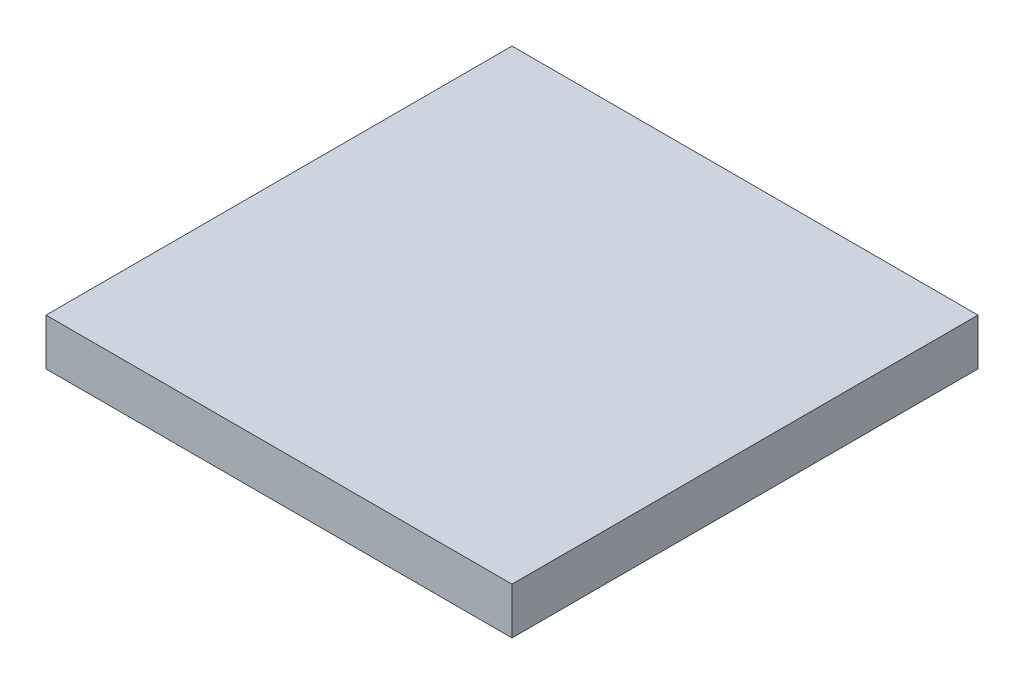
ISO-10303-21;
HEADER;
FILE_DESCRIPTION(('STEP AP214'),'2;1');
FILE_NAME('part.step','',(''),(''),'','','');
FILE_SCHEMA(('AUTOMOTIVE_DESIGN { 1 0 10303 214 1 1 1 1 }'));
ENDSEC;
DATA;
#1=APPLICATION_CONTEXT('core data for automotive mechanical design processes');
#2=APPLICATION_PROTOCOL_DEFINITION('international standard','automotive_design',2000,#1);
#3=PRODUCT_CONTEXT('',#1,'mechanical');
#4=PRODUCT('Part','Part','',(#3));
#5=PRODUCT_RELATED_PRODUCT_CATEGORY('part','',(#4));
#6=PRODUCT_DEFINITION_FORMATION('','',#4);
#7=PRODUCT_DEFINITION_CONTEXT('part definition',#1,'design');
#8=PRODUCT_DEFINITION('design','',#6,#7);
#9=PRODUCT_DEFINITION_SHAPE('','',#8);
#10=(LENGTH_UNIT() NAMED_UNIT(*) SI_UNIT(.MILLI.,.METRE.));
#11=(NAMED_UNIT(*) PLANE_ANGLE_UNIT() SI_UNIT($,.RADIAN.));
#12=(NAMED_UNIT(*) SI_UNIT($,.STERADIAN.) SOLID_ANGLE_UNIT());
#13=UNCERTAINTY_MEASURE_WITH_UNIT(LENGTH_MEASURE(1.E-05),#10,'distance_accuracy_value','');
#14=(GEOMETRIC_REPRESENTATION_CONTEXT(3) GLOBAL_UNCERTAINTY_ASSIGNED_CONTEXT((#13)) GLOBAL_UNIT_ASSIGNED_CONTEXT((#10,
#11,#12)) REPRESENTATION_CONTEXT('',''));
#15=CARTESIAN_POINT('',(0.,0.,0.));
#16=DIRECTION('',(0.,0.,1.));
#17=DIRECTION('',(1.,0.,0.));
#18=AXIS2_PLACEMENT_3D('',#15,#16,#17);
#19=CARTESIAN_POINT('',(0.,10.,0.));
#20=DIRECTION('',(1.,0.,0.));
#21=DIRECTION('',(0.,0.,-1.));
#22=AXIS2_PLACEMENT_3D('',#19,#20,#21);
#23=PLANE('',#22);
#24=DIRECTION('',(0.,0.,1.));
#25=VECTOR('',#24,1.);
#26=CARTESIAN_POINT('',(0.,0.,0.));
#27=LINE('',#26,#25);
#28=CARTESIAN_POINT('',(0.,0.,-100.));
#29=VERTEX_POINT('',#28);
#30=CARTESIAN_POINT('',(0.,0.,0.));
#31=VERTEX_POINT('',#30);
#32=EDGE_CURVE('E96',#29,#31,#27,.T.);
#33=ORIENTED_EDGE('',*,*,#32,.T.);
#34=DIRECTION('',(0.,-1.,0.));
#35=VECTOR('',#34,1.);
#36=CARTESIAN_POINT('',(0.,10.,0.));
#37=LINE('',#36,#35);
#38=CARTESIAN_POINT('',(0.,10.,0.));
#39=VERTEX_POINT('',#38);
#40=EDGE_CURVE('E11',#39,#31,#37,.T.);
#41=ORIENTED_EDGE('',*,*,#40,.F.);
#42=DIRECTION('',(0.,0.,1.));
#43=VECTOR('',#42,1.);
#44=CARTESIAN_POINT('',(0.,10.,0.));
#45=LINE('',#44,#43);
#46=CARTESIAN_POINT('',(0.,10.,-100.));
#47=VERTEX_POINT('',#46);
#48=EDGE_CURVE('E84',#47,#39,#45,.T.);
#49=ORIENTED_EDGE('',*,*,#48,.F.);
#50=DIRECTION('',(0.,-1.,0.));
#51=VECTOR('',#50,1.);
#52=CARTESIAN_POINT('',(0.,10.,-100.));
#53=LINE('',#52,#51);
#54=EDGE_CURVE('E92',#47,#29,#53,.T.);
#55=ORIENTED_EDGE('',*,*,#54,.T.);
#56=EDGE_LOOP('',(#33,#41,#49,#55));
#57=FACE_BOUND('',#56,.T.);
#58=ADVANCED_FACE('F33',(#57),#23,.F.);
#59=CARTESIAN_POINT('',(0.,10.,0.));
#60=DIRECTION('',(0.,0.,-1.));
#61=DIRECTION('',(-1.,0.,0.));
#62=AXIS2_PLACEMENT_3D('',#59,#60,#61);
#63=PLANE('',#62);
#64=DIRECTION('',(1.,0.,0.));
#65=VECTOR('',#64,1.);
#66=CARTESIAN_POINT('',(0.,0.,0.));
#67=LINE('',#66,#65);
#68=CARTESIAN_POINT('',(100.,0.,0.));
#69=VERTEX_POINT('',#68);
#70=EDGE_CURVE('E88',#31,#69,#67,.T.);
#71=ORIENTED_EDGE('',*,*,#70,.T.);
#72=DIRECTION('',(0.,-1.,0.));
#73=VECTOR('',#72,1.);
#74=CARTESIAN_POINT('',(100.,10.,0.));
#75=LINE('',#74,#73);
#76=CARTESIAN_POINT('',(100.,10.,0.));
#77=VERTEX_POINT('',#76);
#78=EDGE_CURVE('E41',#77,#69,#75,.T.);
#79=ORIENTED_EDGE('',*,*,#78,.F.);
#80=DIRECTION('',(1.,0.,0.));
#81=VECTOR('',#80,1.);
#82=CARTESIAN_POINT('',(0.,10.,0.));
#83=LINE('',#82,#81);
#84=EDGE_CURVE('E79',#39,#77,#83,.T.);
#85=ORIENTED_EDGE('',*,*,#84,.F.);
#86=ORIENTED_EDGE('',*,*,#40,.T.);
#87=EDGE_LOOP('',(#71,#79,#85,#86));
#88=FACE_BOUND('',#87,.T.);
#89=ADVANCED_FACE('F87',(#88),#63,.F.);
#90=CARTESIAN_POINT('',(100.,10.,0.));
#91=DIRECTION('',(-1.,0.,0.));
#92=DIRECTION('',(0.,0.,1.));
#93=AXIS2_PLACEMENT_3D('',#90,#91,#92);
#94=PLANE('',#93);
#95=DIRECTION('',(0.,0.,-1.));
#96=VECTOR('',#95,1.);
#97=CARTESIAN_POINT('',(100.,0.,0.));
#98=LINE('',#97,#96);
#99=CARTESIAN_POINT('',(100.,0.,-100.));
#100=VERTEX_POINT('',#99);
#101=EDGE_CURVE('E66',#69,#100,#98,.T.);
#102=ORIENTED_EDGE('',*,*,#101,.T.);
#103=DIRECTION('',(0.,-1.,0.));
#104=VECTOR('',#103,1.);
#105=CARTESIAN_POINT('',(100.,10.,-100.));
#106=LINE('',#105,#104);
#107=CARTESIAN_POINT('',(100.,10.,-100.));
#108=VERTEX_POINT('',#107);
#109=EDGE_CURVE('E89',#108,#100,#106,.T.);
#110=ORIENTED_EDGE('',*,*,#109,.F.);
#111=DIRECTION('',(0.,0.,-1.));
#112=VECTOR('',#111,1.);
#113=CARTESIAN_POINT('',(100.,10.,0.));
#114=LINE('',#113,#112);
#115=EDGE_CURVE('E82',#77,#108,#114,.T.);
#116=ORIENTED_EDGE('',*,*,#115,.F.);
#117=ORIENTED_EDGE('',*,*,#78,.T.);
#118=EDGE_LOOP('',(#102,#110,#116,#117));
#119=FACE_BOUND('',#118,.T.);
#120=ADVANCED_FACE('F90',(#119),#94,.F.);
#121=CARTESIAN_POINT('',(0.,10.,-100.));
#122=DIRECTION('',(0.,0.,1.));
#123=DIRECTION('',(1.,0.,0.));
#124=AXIS2_PLACEMENT_3D('',#121,#122,#123);
#125=PLANE('',#124);
#126=DIRECTION('',(-1.,0.,0.));
#127=VECTOR('',#126,1.);
#128=CARTESIAN_POINT('',(0.,0.,-100.));
#129=LINE('',#128,#127);
#130=EDGE_CURVE('E72',#100,#29,#129,.T.);
#131=ORIENTED_EDGE('',*,*,#130,.T.);
#132=ORIENTED_EDGE('',*,*,#54,.F.);
#133=DIRECTION('',(-1.,0.,0.));
#134=VECTOR('',#133,1.);
#135=CARTESIAN_POINT('',(0.,10.,-100.));
#136=LINE('',#135,#134);
#137=EDGE_CURVE('E49',#108,#47,#136,.T.);
#138=ORIENTED_EDGE('',*,*,#137,.F.);
#139=ORIENTED_EDGE('',*,*,#109,.T.);
#140=EDGE_LOOP('',(#131,#132,#138,#139));
#141=FACE_BOUND('',#140,.T.);
#142=ADVANCED_FACE('F103',(#141),#125,.F.);
#143=CARTESIAN_POINT('',(0.,10.,0.));
#144=DIRECTION('',(0.,-1.,0.));
#145=DIRECTION('',(0.,0.,-1.));
#146=AXIS2_PLACEMENT_3D('',#143,#144,#145);
#147=PLANE('',#146);
#148=ORIENTED_EDGE('',*,*,#48,.T.);
#149=ORIENTED_EDGE('',*,*,#84,.T.);
#150=ORIENTED_EDGE('',*,*,#115,.T.);
#151=ORIENTED_EDGE('',*,*,#137,.T.);
#152=EDGE_LOOP('',(#148,#149,#150,#151));
#153=FACE_BOUND('',#152,.T.);
#154=ADVANCED_FACE('F80',(#153),#147,.F.);
#155=CARTESIAN_POINT('',(0.,0.,0.));
#156=DIRECTION('',(0.,-1.,0.));
#157=DIRECTION('',(0.,0.,-1.));
#158=AXIS2_PLACEMENT_3D('',#155,#156,#157);
#159=PLANE('',#158);
#160=ORIENTED_EDGE('',*,*,#32,.F.);
#161=ORIENTED_EDGE('',*,*,#130,.F.);
#162=ORIENTED_EDGE('',*,*,#101,.F.);
#163=ORIENTED_EDGE('',*,*,#70,.F.);
#164=EDGE_LOOP('',(#160,#161,#162,#163));
#165=FACE_BOUND('',#164,.T.);
#166=ADVANCED_FACE('F106',(#165),#159,.T.);
#167=CLOSED_SHELL('',(#58,#89,#120,#142,#154,#166));
#168=MANIFOLD_SOLID_BREP('B2',#167);
#169=ADVANCED_BREP_SHAPE_REPRESENTATION('',(#18,#168),#14);
#170=SHAPE_DEFINITION_REPRESENTATION(#9,#169);
ENDSEC;
END-ISO-10303-21;
